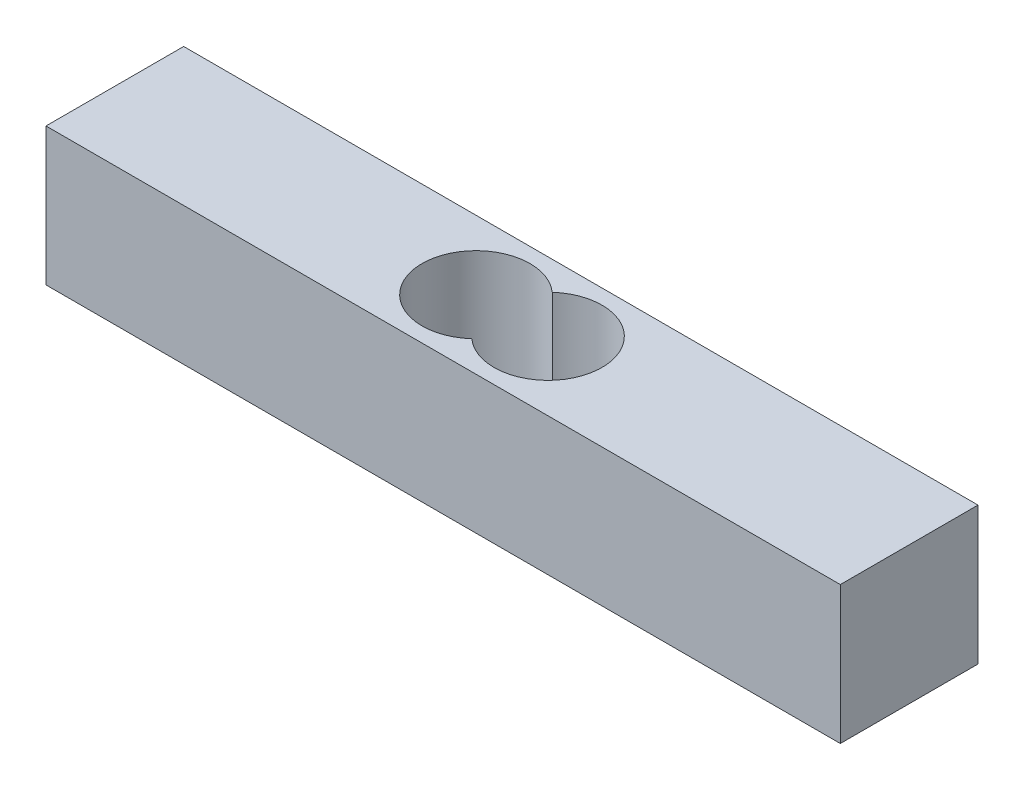
ISO-10303-21;
HEADER;
FILE_DESCRIPTION(('STEP AP214'),'2;1');
FILE_NAME('part.step','',(''),(''),'','','');
FILE_SCHEMA(('AUTOMOTIVE_DESIGN { 1 0 10303 214 1 1 1 1 }'));
ENDSEC;
DATA;
#1=APPLICATION_CONTEXT('core data for automotive mechanical design processes');
#2=APPLICATION_PROTOCOL_DEFINITION('international standard','automotive_design',2000,#1);
#3=PRODUCT_CONTEXT('',#1,'mechanical');
#4=PRODUCT('Part','Part','',(#3));
#5=PRODUCT_RELATED_PRODUCT_CATEGORY('part','',(#4));
#6=PRODUCT_DEFINITION_FORMATION('','',#4);
#7=PRODUCT_DEFINITION_CONTEXT('part definition',#1,'design');
#8=PRODUCT_DEFINITION('design','',#6,#7);
#9=PRODUCT_DEFINITION_SHAPE('','',#8);
#10=(LENGTH_UNIT() NAMED_UNIT(*) SI_UNIT(.MILLI.,.METRE.));
#11=(NAMED_UNIT(*) PLANE_ANGLE_UNIT() SI_UNIT($,.RADIAN.));
#12=(NAMED_UNIT(*) SI_UNIT($,.STERADIAN.) SOLID_ANGLE_UNIT());
#13=UNCERTAINTY_MEASURE_WITH_UNIT(LENGTH_MEASURE(1.E-05),#10,'distance_accuracy_value','');
#14=(GEOMETRIC_REPRESENTATION_CONTEXT(3) GLOBAL_UNCERTAINTY_ASSIGNED_CONTEXT((#13)) GLOBAL_UNIT_ASSIGNED_CONTEXT((#10,
#11,#12)) REPRESENTATION_CONTEXT('',''));
#15=CARTESIAN_POINT('',(0.,0.,0.));
#16=DIRECTION('',(0.,0.,1.));
#17=DIRECTION('',(1.,0.,0.));
#18=AXIS2_PLACEMENT_3D('',#15,#16,#17);
#19=CARTESIAN_POINT('',(0.,13.,0.));
#20=DIRECTION('',(0.,1.,0.));
#21=DIRECTION('',(0.,0.,1.));
#22=AXIS2_PLACEMENT_3D('',#19,#20,#21);
#23=PLANE('',#22);
#24=DIRECTION('',(0.,0.,-1.));
#25=VECTOR('',#24,1.);
#26=CARTESIAN_POINT('',(37.5,13.,-6.5));
#27=LINE('',#26,#25);
#28=CARTESIAN_POINT('',(37.5,13.,6.5));
#29=VERTEX_POINT('',#28);
#30=CARTESIAN_POINT('',(37.5,13.,-6.5));
#31=VERTEX_POINT('',#30);
#32=EDGE_CURVE('E105',#29,#31,#27,.T.);
#33=ORIENTED_EDGE('',*,*,#32,.T.);
#34=DIRECTION('',(-1.,0.,0.));
#35=VECTOR('',#34,1.);
#36=CARTESIAN_POINT('',(-37.5,13.,-6.5));
#37=LINE('',#36,#35);
#38=CARTESIAN_POINT('',(-37.5,13.,-6.5));
#39=VERTEX_POINT('',#38);
#40=EDGE_CURVE('E108',#31,#39,#37,.T.);
#41=ORIENTED_EDGE('',*,*,#40,.T.);
#42=DIRECTION('',(0.,0.,1.));
#43=VECTOR('',#42,1.);
#44=CARTESIAN_POINT('',(-37.5,13.,-6.5));
#45=LINE('',#44,#43);
#46=CARTESIAN_POINT('',(-37.5,13.,6.5));
#47=VERTEX_POINT('',#46);
#48=EDGE_CURVE('E111',#39,#47,#45,.T.);
#49=ORIENTED_EDGE('',*,*,#48,.T.);
#50=DIRECTION('',(1.,0.,0.));
#51=VECTOR('',#50,1.);
#52=CARTESIAN_POINT('',(-37.5,13.,6.5));
#53=LINE('',#52,#51);
#54=EDGE_CURVE('E113',#47,#29,#53,.T.);
#55=ORIENTED_EDGE('',*,*,#54,.T.);
#56=EDGE_LOOP('',(#33,#41,#49,#55));
#57=FACE_BOUND('',#56,.T.);
#58=CARTESIAN_POINT('',(-3.39999999999999,13.,0.));
#59=DIRECTION('',(0.,1.,0.));
#60=DIRECTION('',(0.,0.,1.));
#61=AXIS2_PLACEMENT_3D('',#58,#59,#60);
#62=CIRCLE('',#61,5.1);
#63=CARTESIAN_POINT('',(0.,13.,-3.80131556174965));
#64=VERTEX_POINT('',#63);
#65=CARTESIAN_POINT('',(0.,13.,3.80131556174965));
#66=VERTEX_POINT('',#65);
#67=EDGE_CURVE('E88',#64,#66,#62,.T.);
#68=ORIENTED_EDGE('',*,*,#67,.F.);
#69=CARTESIAN_POINT('',(3.39999999999999,13.,0.));
#70=DIRECTION('',(0.,1.,0.));
#71=DIRECTION('',(0.,0.,-1.));
#72=AXIS2_PLACEMENT_3D('',#69,#70,#71);
#73=CIRCLE('',#72,5.1);
#74=EDGE_CURVE('E94',#66,#64,#73,.T.);
#75=ORIENTED_EDGE('',*,*,#74,.F.);
#76=EDGE_LOOP('',(#68,#75));
#77=FACE_BOUND('',#76,.T.);
#78=ADVANCED_FACE('F36',(#57,#77),#23,.T.);
#79=CARTESIAN_POINT('',(0.,0.,0.));
#80=DIRECTION('',(0.,1.,0.));
#81=DIRECTION('',(0.,0.,1.));
#82=AXIS2_PLACEMENT_3D('',#79,#80,#81);
#83=PLANE('',#82);
#84=DIRECTION('',(0.,0.,-1.));
#85=VECTOR('',#84,1.);
#86=CARTESIAN_POINT('',(37.5,0.,-6.5));
#87=LINE('',#86,#85);
#88=CARTESIAN_POINT('',(37.5,0.,6.5));
#89=VERTEX_POINT('',#88);
#90=CARTESIAN_POINT('',(37.5,0.,-6.5));
#91=VERTEX_POINT('',#90);
#92=EDGE_CURVE('E104',#89,#91,#87,.T.);
#93=ORIENTED_EDGE('',*,*,#92,.F.);
#94=DIRECTION('',(1.,0.,0.));
#95=VECTOR('',#94,1.);
#96=CARTESIAN_POINT('',(-37.5,0.,6.5));
#97=LINE('',#96,#95);
#98=CARTESIAN_POINT('',(-37.5,0.,6.5));
#99=VERTEX_POINT('',#98);
#100=EDGE_CURVE('E109',#99,#89,#97,.T.);
#101=ORIENTED_EDGE('',*,*,#100,.F.);
#102=DIRECTION('',(0.,0.,1.));
#103=VECTOR('',#102,1.);
#104=CARTESIAN_POINT('',(-37.5,0.,-6.5));
#105=LINE('',#104,#103);
#106=CARTESIAN_POINT('',(-37.5,0.,-6.5));
#107=VERTEX_POINT('',#106);
#108=EDGE_CURVE('E120',#107,#99,#105,.T.);
#109=ORIENTED_EDGE('',*,*,#108,.F.);
#110=DIRECTION('',(-1.,0.,0.));
#111=VECTOR('',#110,1.);
#112=CARTESIAN_POINT('',(-37.5,0.,-6.5));
#113=LINE('',#112,#111);
#114=EDGE_CURVE('E118',#91,#107,#113,.T.);
#115=ORIENTED_EDGE('',*,*,#114,.F.);
#116=EDGE_LOOP('',(#93,#101,#109,#115));
#117=FACE_BOUND('',#116,.T.);
#118=CARTESIAN_POINT('',(3.39999999999999,0.,0.));
#119=DIRECTION('',(0.,1.,0.));
#120=DIRECTION('',(0.,0.,-1.));
#121=AXIS2_PLACEMENT_3D('',#118,#119,#120);
#122=CIRCLE('',#121,5.1);
#123=CARTESIAN_POINT('',(0.,0.,3.80131556174965));
#124=VERTEX_POINT('',#123);
#125=CARTESIAN_POINT('',(0.,0.,-3.80131556174965));
#126=VERTEX_POINT('',#125);
#127=EDGE_CURVE('E58',#124,#126,#122,.T.);
#128=ORIENTED_EDGE('',*,*,#127,.T.);
#129=CARTESIAN_POINT('',(-3.39999999999999,0.,0.));
#130=DIRECTION('',(0.,1.,0.));
#131=DIRECTION('',(0.,0.,1.));
#132=AXIS2_PLACEMENT_3D('',#129,#130,#131);
#133=CIRCLE('',#132,5.1);
#134=EDGE_CURVE('E98',#126,#124,#133,.T.);
#135=ORIENTED_EDGE('',*,*,#134,.T.);
#136=EDGE_LOOP('',(#128,#135));
#137=FACE_BOUND('',#136,.T.);
#138=ADVANCED_FACE('F138',(#117,#137),#83,.F.);
#139=CARTESIAN_POINT('',(37.5,13.,-6.5));
#140=DIRECTION('',(-1.,0.,0.));
#141=DIRECTION('',(0.,0.,1.));
#142=AXIS2_PLACEMENT_3D('',#139,#140,#141);
#143=PLANE('',#142);
#144=ORIENTED_EDGE('',*,*,#92,.T.);
#145=DIRECTION('',(0.,-1.,0.));
#146=VECTOR('',#145,1.);
#147=CARTESIAN_POINT('',(37.5,13.,-6.5));
#148=LINE('',#147,#146);
#149=EDGE_CURVE('E11',#31,#91,#148,.T.);
#150=ORIENTED_EDGE('',*,*,#149,.F.);
#151=ORIENTED_EDGE('',*,*,#32,.F.);
#152=DIRECTION('',(0.,-1.,0.));
#153=VECTOR('',#152,1.);
#154=CARTESIAN_POINT('',(37.5,13.,6.5));
#155=LINE('',#154,#153);
#156=EDGE_CURVE('E115',#29,#89,#155,.T.);
#157=ORIENTED_EDGE('',*,*,#156,.T.);
#158=EDGE_LOOP('',(#144,#150,#151,#157));
#159=FACE_BOUND('',#158,.T.);
#160=ADVANCED_FACE('F38',(#159),#143,.F.);
#161=CARTESIAN_POINT('',(-37.5,13.,-6.5));
#162=DIRECTION('',(0.,0.,1.));
#163=DIRECTION('',(1.,0.,0.));
#164=AXIS2_PLACEMENT_3D('',#161,#162,#163);
#165=PLANE('',#164);
#166=ORIENTED_EDGE('',*,*,#114,.T.);
#167=DIRECTION('',(0.,-1.,0.));
#168=VECTOR('',#167,1.);
#169=CARTESIAN_POINT('',(-37.5,13.,-6.5));
#170=LINE('',#169,#168);
#171=EDGE_CURVE('E44',#39,#107,#170,.T.);
#172=ORIENTED_EDGE('',*,*,#171,.F.);
#173=ORIENTED_EDGE('',*,*,#40,.F.);
#174=ORIENTED_EDGE('',*,*,#149,.T.);
#175=EDGE_LOOP('',(#166,#172,#173,#174));
#176=FACE_BOUND('',#175,.T.);
#177=ADVANCED_FACE('F148',(#176),#165,.F.);
#178=CARTESIAN_POINT('',(-37.5,13.,-6.5));
#179=DIRECTION('',(1.,0.,0.));
#180=DIRECTION('',(0.,0.,-1.));
#181=AXIS2_PLACEMENT_3D('',#178,#179,#180);
#182=PLANE('',#181);
#183=ORIENTED_EDGE('',*,*,#108,.T.);
#184=DIRECTION('',(0.,-1.,0.));
#185=VECTOR('',#184,1.);
#186=CARTESIAN_POINT('',(-37.5,13.,6.5));
#187=LINE('',#186,#185);
#188=EDGE_CURVE('E125',#47,#99,#187,.T.);
#189=ORIENTED_EDGE('',*,*,#188,.F.);
#190=ORIENTED_EDGE('',*,*,#48,.F.);
#191=ORIENTED_EDGE('',*,*,#171,.T.);
#192=EDGE_LOOP('',(#183,#189,#190,#191));
#193=FACE_BOUND('',#192,.T.);
#194=ADVANCED_FACE('F132',(#193),#182,.F.);
#195=CARTESIAN_POINT('',(-37.5,13.,6.5));
#196=DIRECTION('',(0.,0.,-1.));
#197=DIRECTION('',(-1.,0.,0.));
#198=AXIS2_PLACEMENT_3D('',#195,#196,#197);
#199=PLANE('',#198);
#200=ORIENTED_EDGE('',*,*,#100,.T.);
#201=ORIENTED_EDGE('',*,*,#156,.F.);
#202=ORIENTED_EDGE('',*,*,#54,.F.);
#203=ORIENTED_EDGE('',*,*,#188,.T.);
#204=EDGE_LOOP('',(#200,#201,#202,#203));
#205=FACE_BOUND('',#204,.T.);
#206=ADVANCED_FACE('F142',(#205),#199,.F.);
#207=CARTESIAN_POINT('',(3.39999999999999,13.,0.));
#208=DIRECTION('',(0.,-1.,0.));
#209=DIRECTION('',(0.,0.,-1.));
#210=AXIS2_PLACEMENT_3D('',#207,#208,#209);
#211=CYLINDRICAL_SURFACE('',#210,5.1);
#212=ORIENTED_EDGE('',*,*,#127,.F.);
#213=DIRECTION('',(0.,-1.,0.));
#214=VECTOR('',#213,1.);
#215=CARTESIAN_POINT('',(0.,13.,3.80131556174965));
#216=LINE('',#215,#214);
#217=EDGE_CURVE('E90',#66,#124,#216,.T.);
#218=ORIENTED_EDGE('',*,*,#217,.F.);
#219=ORIENTED_EDGE('',*,*,#74,.T.);
#220=DIRECTION('',(0.,-1.,0.));
#221=VECTOR('',#220,1.);
#222=CARTESIAN_POINT('',(0.,13.,-3.80131556174965));
#223=LINE('',#222,#221);
#224=EDGE_CURVE('E51',#64,#126,#223,.T.);
#225=ORIENTED_EDGE('',*,*,#224,.T.);
#226=EDGE_LOOP('',(#212,#218,#219,#225));
#227=FACE_BOUND('',#226,.T.);
#228=ADVANCED_FACE('F96',(#227),#211,.F.);
#229=CARTESIAN_POINT('',(-3.39999999999999,13.,0.));
#230=DIRECTION('',(0.,-1.,0.));
#231=DIRECTION('',(0.,0.,-1.));
#232=AXIS2_PLACEMENT_3D('',#229,#230,#231);
#233=CYLINDRICAL_SURFACE('',#232,5.1);
#234=ORIENTED_EDGE('',*,*,#134,.F.);
#235=ORIENTED_EDGE('',*,*,#224,.F.);
#236=ORIENTED_EDGE('',*,*,#67,.T.);
#237=ORIENTED_EDGE('',*,*,#217,.T.);
#238=EDGE_LOOP('',(#234,#235,#236,#237));
#239=FACE_BOUND('',#238,.T.);
#240=ADVANCED_FACE('F89',(#239),#233,.F.);
#241=CLOSED_SHELL('',(#78,#138,#160,#177,#194,#206,#228,#240));
#242=MANIFOLD_SOLID_BREP('B2',#241);
#243=ADVANCED_BREP_SHAPE_REPRESENTATION('',(#18,#242),#14);
#244=SHAPE_DEFINITION_REPRESENTATION(#9,#243);
ENDSEC;
END-ISO-10303-21;
